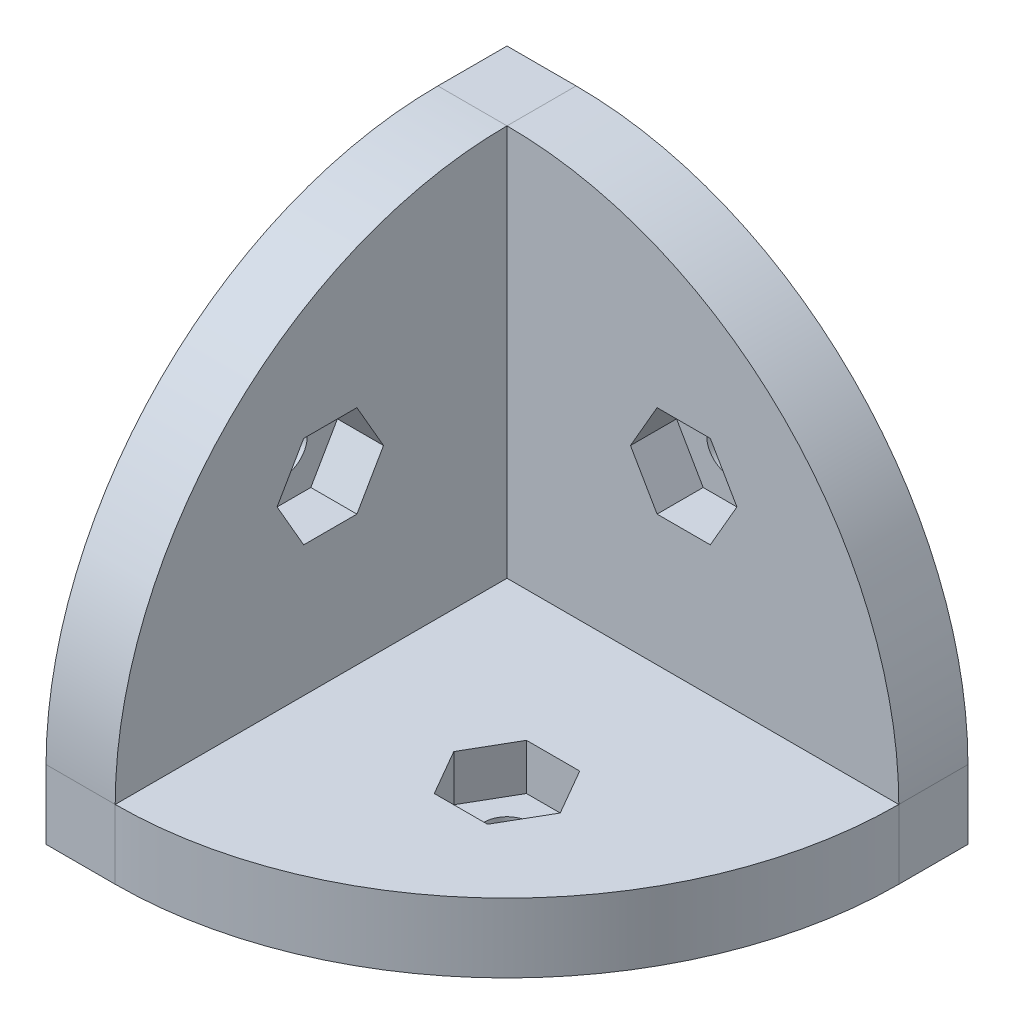
ISO-10303-21;
HEADER;
FILE_DESCRIPTION(('STEP AP214'),'2;1');
FILE_NAME('part.step','',(''),(''),'','','');
FILE_SCHEMA(('AUTOMOTIVE_DESIGN { 1 0 10303 214 1 1 1 1 }'));
ENDSEC;
DATA;
#1=APPLICATION_CONTEXT('core data for automotive mechanical design processes');
#2=APPLICATION_PROTOCOL_DEFINITION('international standard','automotive_design',2000,#1);
#3=PRODUCT_CONTEXT('',#1,'mechanical');
#4=PRODUCT('Part','Part','',(#3));
#5=PRODUCT_RELATED_PRODUCT_CATEGORY('part','',(#4));
#6=PRODUCT_DEFINITION_FORMATION('','',#4);
#7=PRODUCT_DEFINITION_CONTEXT('part definition',#1,'design');
#8=PRODUCT_DEFINITION('design','',#6,#7);
#9=PRODUCT_DEFINITION_SHAPE('','',#8);
#10=(LENGTH_UNIT() NAMED_UNIT(*) SI_UNIT(.MILLI.,.METRE.));
#11=(NAMED_UNIT(*) PLANE_ANGLE_UNIT() SI_UNIT($,.RADIAN.));
#12=(NAMED_UNIT(*) SI_UNIT($,.STERADIAN.) SOLID_ANGLE_UNIT());
#13=UNCERTAINTY_MEASURE_WITH_UNIT(LENGTH_MEASURE(1.E-05),#10,'distance_accuracy_value','');
#14=(GEOMETRIC_REPRESENTATION_CONTEXT(3) GLOBAL_UNCERTAINTY_ASSIGNED_CONTEXT((#13)) GLOBAL_UNIT_ASSIGNED_CONTEXT((#10,
#11,#12)) REPRESENTATION_CONTEXT('',''));
#15=CARTESIAN_POINT('',(0.,0.,0.));
#16=DIRECTION('',(0.,0.,1.));
#17=DIRECTION('',(1.,0.,0.));
#18=AXIS2_PLACEMENT_3D('',#15,#16,#17);
#19=CARTESIAN_POINT('',(0.,16.,16.));
#20=DIRECTION('',(1.,0.,0.));
#21=DIRECTION('',(0.,1.,0.));
#22=AXIS2_PLACEMENT_3D('',#19,#20,#21);
#23=CYLINDRICAL_SURFACE('',#22,1.5);
#24=CARTESIAN_POINT('',(0.,16.,16.));
#25=DIRECTION('',(1.,0.,0.));
#26=DIRECTION('',(0.,1.,0.));
#27=AXIS2_PLACEMENT_3D('',#24,#25,#26);
#28=CIRCLE('',#27,1.5);
#29=CARTESIAN_POINT('',(0.,17.5,16.));
#30=VERTEX_POINT('',#29);
#31=EDGE_CURVE('E259',#30,#30,#28,.T.);
#32=ORIENTED_EDGE('',*,*,#31,.F.);
#33=EDGE_LOOP('',(#32));
#34=FACE_BOUND('',#33,.T.);
#35=CARTESIAN_POINT('',(1.5,16.,16.));
#36=DIRECTION('',(1.,0.,0.));
#37=DIRECTION('',(0.,0.,-1.));
#38=AXIS2_PLACEMENT_3D('',#35,#36,#37);
#39=CIRCLE('',#38,1.5);
#40=CARTESIAN_POINT('',(1.5,16.,14.5));
#41=VERTEX_POINT('',#40);
#42=EDGE_CURVE('E39',#41,#41,#39,.F.);
#43=ORIENTED_EDGE('',*,*,#42,.F.);
#44=EDGE_LOOP('',(#43));
#45=FACE_BOUND('',#44,.T.);
#46=ADVANCED_FACE('F35',(#34,#45),#23,.F.);
#47=CARTESIAN_POINT('',(16.,0.,16.));
#48=DIRECTION('',(0.,1.,0.));
#49=DIRECTION('',(-1.,0.,0.));
#50=AXIS2_PLACEMENT_3D('',#47,#48,#49);
#51=CYLINDRICAL_SURFACE('',#50,1.5);
#52=CARTESIAN_POINT('',(16.,0.,16.));
#53=DIRECTION('',(0.,1.,0.));
#54=DIRECTION('',(-1.,0.,0.));
#55=AXIS2_PLACEMENT_3D('',#52,#53,#54);
#56=CIRCLE('',#55,1.5);
#57=CARTESIAN_POINT('',(14.5,0.,16.));
#58=VERTEX_POINT('',#57);
#59=EDGE_CURVE('E309',#58,#58,#56,.T.);
#60=ORIENTED_EDGE('',*,*,#59,.F.);
#61=EDGE_LOOP('',(#60));
#62=FACE_BOUND('',#61,.T.);
#63=CARTESIAN_POINT('',(16.,1.5,16.));
#64=DIRECTION('',(0.,1.,0.));
#65=DIRECTION('',(0.,0.,1.));
#66=AXIS2_PLACEMENT_3D('',#63,#64,#65);
#67=CIRCLE('',#66,1.5);
#68=CARTESIAN_POINT('',(16.,1.5,17.5));
#69=VERTEX_POINT('',#68);
#70=EDGE_CURVE('E299',#69,#69,#67,.F.);
#71=ORIENTED_EDGE('',*,*,#70,.F.);
#72=EDGE_LOOP('',(#71));
#73=FACE_BOUND('',#72,.T.);
#74=ADVANCED_FACE('F430',(#62,#73),#51,.F.);
#75=CARTESIAN_POINT('',(16.,16.,0.));
#76=DIRECTION('',(0.,0.,1.));
#77=DIRECTION('',(1.,0.,0.));
#78=AXIS2_PLACEMENT_3D('',#75,#76,#77);
#79=CYLINDRICAL_SURFACE('',#78,1.5);
#80=CARTESIAN_POINT('',(16.,16.,0.));
#81=DIRECTION('',(0.,0.,1.));
#82=DIRECTION('',(1.,0.,0.));
#83=AXIS2_PLACEMENT_3D('',#80,#81,#82);
#84=CIRCLE('',#83,1.5);
#85=CARTESIAN_POINT('',(17.5,16.,0.));
#86=VERTEX_POINT('',#85);
#87=EDGE_CURVE('E361',#86,#86,#84,.T.);
#88=ORIENTED_EDGE('',*,*,#87,.F.);
#89=EDGE_LOOP('',(#88));
#90=FACE_BOUND('',#89,.T.);
#91=CARTESIAN_POINT('',(16.,16.,1.5));
#92=DIRECTION('',(0.,0.,1.));
#93=DIRECTION('',(1.,0.,0.));
#94=AXIS2_PLACEMENT_3D('',#91,#92,#93);
#95=CIRCLE('',#94,1.5);
#96=CARTESIAN_POINT('',(17.5,16.,1.5));
#97=VERTEX_POINT('',#96);
#98=EDGE_CURVE('E350',#97,#97,#95,.F.);
#99=ORIENTED_EDGE('',*,*,#98,.F.);
#100=EDGE_LOOP('',(#99));
#101=FACE_BOUND('',#100,.T.);
#102=ADVANCED_FACE('F432',(#90,#101),#79,.F.);
#103=CARTESIAN_POINT('',(4.5,4.5,30.));
#104=DIRECTION('',(0.,1.,0.));
#105=DIRECTION('',(-1.,0.,0.));
#106=AXIS2_PLACEMENT_3D('',#103,#104,#105);
#107=PLANE('',#106);
#108=DIRECTION('',(0.5,0.,-0.866025403784438));
#109=VECTOR('',#108,1.);
#110=CARTESIAN_POINT('',(17.7320508075689,4.5,19.));
#111=LINE('',#110,#109);
#112=CARTESIAN_POINT('',(17.7320508075689,4.5,19.));
#113=VERTEX_POINT('',#112);
#114=CARTESIAN_POINT('',(19.4641016151378,4.5,16.));
#115=VERTEX_POINT('',#114);
#116=EDGE_CURVE('E60',#113,#115,#111,.T.);
#117=ORIENTED_EDGE('',*,*,#116,.F.);
#118=DIRECTION('',(1.,0.,0.));
#119=VECTOR('',#118,1.);
#120=CARTESIAN_POINT('',(14.2679491924311,4.5,19.));
#121=LINE('',#120,#119);
#122=CARTESIAN_POINT('',(14.2679491924311,4.5,19.));
#123=VERTEX_POINT('',#122);
#124=EDGE_CURVE('E266',#123,#113,#121,.T.);
#125=ORIENTED_EDGE('',*,*,#124,.F.);
#126=DIRECTION('',(0.5,0.,0.866025403784439));
#127=VECTOR('',#126,1.);
#128=CARTESIAN_POINT('',(12.5358983848622,4.5,16.));
#129=LINE('',#128,#127);
#130=CARTESIAN_POINT('',(12.5358983848622,4.5,16.));
#131=VERTEX_POINT('',#130);
#132=EDGE_CURVE('E292',#131,#123,#129,.T.);
#133=ORIENTED_EDGE('',*,*,#132,.F.);
#134=DIRECTION('',(-0.5,0.,0.866025403784439));
#135=VECTOR('',#134,1.);
#136=CARTESIAN_POINT('',(14.2679491924311,4.5,13.));
#137=LINE('',#136,#135);
#138=CARTESIAN_POINT('',(14.2679491924311,4.5,13.));
#139=VERTEX_POINT('',#138);
#140=EDGE_CURVE('E289',#139,#131,#137,.T.);
#141=ORIENTED_EDGE('',*,*,#140,.F.);
#142=DIRECTION('',(-1.,0.,0.));
#143=VECTOR('',#142,1.);
#144=CARTESIAN_POINT('',(17.7320508075689,4.5,13.));
#145=LINE('',#144,#143);
#146=CARTESIAN_POINT('',(17.7320508075689,4.5,13.));
#147=VERTEX_POINT('',#146);
#148=EDGE_CURVE('E286',#147,#139,#145,.T.);
#149=ORIENTED_EDGE('',*,*,#148,.F.);
#150=DIRECTION('',(-0.499999999999999,0.,-0.866025403784439));
#151=VECTOR('',#150,1.);
#152=CARTESIAN_POINT('',(19.4641016151378,4.5,16.));
#153=LINE('',#152,#151);
#154=EDGE_CURVE('E283',#115,#147,#153,.T.);
#155=ORIENTED_EDGE('',*,*,#154,.F.);
#156=EDGE_LOOP('',(#117,#125,#133,#141,#149,#155));
#157=FACE_BOUND('',#156,.T.);
#158=CARTESIAN_POINT('',(4.5,4.5,4.5));
#159=DIRECTION('',(0.,-1.,0.));
#160=DIRECTION('',(1.,0.,0.));
#161=AXIS2_PLACEMENT_3D('',#158,#159,#160);
#162=CIRCLE('',#161,25.5);
#163=CARTESIAN_POINT('',(30.,4.5,4.5));
#164=VERTEX_POINT('',#163);
#165=CARTESIAN_POINT('',(4.5,4.5,30.));
#166=VERTEX_POINT('',#165);
#167=EDGE_CURVE('E364',#164,#166,#162,.T.);
#168=ORIENTED_EDGE('',*,*,#167,.F.);
#169=DIRECTION('',(-1.,0.,0.));
#170=VECTOR('',#169,1.);
#171=CARTESIAN_POINT('',(4.5,4.5,4.5));
#172=LINE('',#171,#170);
#173=CARTESIAN_POINT('',(4.5,4.5,4.5));
#174=VERTEX_POINT('',#173);
#175=EDGE_CURVE('E11',#164,#174,#172,.T.);
#176=ORIENTED_EDGE('',*,*,#175,.T.);
#177=DIRECTION('',(0.,0.,-1.));
#178=VECTOR('',#177,1.);
#179=CARTESIAN_POINT('',(4.5,4.5,30.));
#180=LINE('',#179,#178);
#181=EDGE_CURVE('E406',#166,#174,#180,.T.);
#182=ORIENTED_EDGE('',*,*,#181,.F.);
#183=EDGE_LOOP('',(#168,#176,#182));
#184=FACE_BOUND('',#183,.T.);
#185=ADVANCED_FACE('F439',(#157,#184),#107,.T.);
#186=CARTESIAN_POINT('',(30.,0.,30.));
#187=DIRECTION('',(0.,-1.,0.));
#188=DIRECTION('',(1.,0.,0.));
#189=AXIS2_PLACEMENT_3D('',#186,#187,#188);
#190=PLANE('',#189);
#191=ORIENTED_EDGE('',*,*,#59,.T.);
#192=EDGE_LOOP('',(#191));
#193=FACE_BOUND('',#192,.T.);
#194=CARTESIAN_POINT('',(4.5,0.,4.5));
#195=DIRECTION('',(0.,-1.,0.));
#196=DIRECTION('',(1.,0.,0.));
#197=AXIS2_PLACEMENT_3D('',#194,#195,#196);
#198=CIRCLE('',#197,25.5);
#199=CARTESIAN_POINT('',(30.,0.,4.5));
#200=VERTEX_POINT('',#199);
#201=CARTESIAN_POINT('',(4.5,0.,30.));
#202=VERTEX_POINT('',#201);
#203=EDGE_CURVE('E365',#200,#202,#198,.T.);
#204=ORIENTED_EDGE('',*,*,#203,.T.);
#205=DIRECTION('',(-1.,0.,0.));
#206=VECTOR('',#205,1.);
#207=CARTESIAN_POINT('',(30.,0.,30.));
#208=LINE('',#207,#206);
#209=CARTESIAN_POINT('',(0.,0.,30.));
#210=VERTEX_POINT('',#209);
#211=EDGE_CURVE('E400',#202,#210,#208,.T.);
#212=ORIENTED_EDGE('',*,*,#211,.T.);
#213=DIRECTION('',(0.,0.,-1.));
#214=VECTOR('',#213,1.);
#215=CARTESIAN_POINT('',(0.,0.,30.));
#216=LINE('',#215,#214);
#217=CARTESIAN_POINT('',(0.,0.,0.));
#218=VERTEX_POINT('',#217);
#219=EDGE_CURVE('E418',#210,#218,#216,.T.);
#220=ORIENTED_EDGE('',*,*,#219,.T.);
#221=DIRECTION('',(-1.,0.,0.));
#222=VECTOR('',#221,1.);
#223=CARTESIAN_POINT('',(30.,0.,0.));
#224=LINE('',#223,#222);
#225=CARTESIAN_POINT('',(30.,0.,0.));
#226=VERTEX_POINT('',#225);
#227=EDGE_CURVE('E409',#226,#218,#224,.T.);
#228=ORIENTED_EDGE('',*,*,#227,.F.);
#229=DIRECTION('',(0.,0.,-1.));
#230=VECTOR('',#229,1.);
#231=CARTESIAN_POINT('',(30.,0.,30.));
#232=LINE('',#231,#230);
#233=EDGE_CURVE('E420',#200,#226,#232,.T.);
#234=ORIENTED_EDGE('',*,*,#233,.F.);
#235=EDGE_LOOP('',(#204,#212,#220,#228,#234));
#236=FACE_BOUND('',#235,.T.);
#237=ADVANCED_FACE('F510',(#193,#236),#190,.T.);
#238=CARTESIAN_POINT('',(4.5,30.,30.));
#239=DIRECTION('',(1.,0.,0.));
#240=DIRECTION('',(0.,1.,0.));
#241=AXIS2_PLACEMENT_3D('',#238,#239,#240);
#242=PLANE('',#241);
#243=DIRECTION('',(0.,-0.866025403784439,0.5));
#244=VECTOR('',#243,1.);
#245=CARTESIAN_POINT('',(4.5,19.,17.7320508075689));
#246=LINE('',#245,#244);
#247=CARTESIAN_POINT('',(4.5,19.,17.7320508075689));
#248=VERTEX_POINT('',#247);
#249=CARTESIAN_POINT('',(4.5,16.,19.4641016151378));
#250=VERTEX_POINT('',#249);
#251=EDGE_CURVE('E52',#248,#250,#246,.T.);
#252=ORIENTED_EDGE('',*,*,#251,.F.);
#253=DIRECTION('',(0.,0.,1.));
#254=VECTOR('',#253,1.);
#255=CARTESIAN_POINT('',(4.5,19.,14.2679491924311));
#256=LINE('',#255,#254);
#257=CARTESIAN_POINT('',(4.5,19.,14.2679491924311));
#258=VERTEX_POINT('',#257);
#259=EDGE_CURVE('E226',#258,#248,#256,.T.);
#260=ORIENTED_EDGE('',*,*,#259,.F.);
#261=DIRECTION('',(0.,0.866025403784439,0.5));
#262=VECTOR('',#261,1.);
#263=CARTESIAN_POINT('',(4.5,16.,12.5358983848622));
#264=LINE('',#263,#262);
#265=CARTESIAN_POINT('',(4.5,16.,12.5358983848622));
#266=VERTEX_POINT('',#265);
#267=EDGE_CURVE('E229',#266,#258,#264,.T.);
#268=ORIENTED_EDGE('',*,*,#267,.F.);
#269=DIRECTION('',(0.,0.866025403784439,-0.5));
#270=VECTOR('',#269,1.);
#271=CARTESIAN_POINT('',(4.5,13.,14.2679491924311));
#272=LINE('',#271,#270);
#273=CARTESIAN_POINT('',(4.5,13.,14.2679491924311));
#274=VERTEX_POINT('',#273);
#275=EDGE_CURVE('E245',#274,#266,#272,.T.);
#276=ORIENTED_EDGE('',*,*,#275,.F.);
#277=DIRECTION('',(0.,0.,-1.));
#278=VECTOR('',#277,1.);
#279=CARTESIAN_POINT('',(4.5,13.,17.7320508075689));
#280=LINE('',#279,#278);
#281=CARTESIAN_POINT('',(4.5,13.,17.7320508075689));
#282=VERTEX_POINT('',#281);
#283=EDGE_CURVE('E242',#282,#274,#280,.T.);
#284=ORIENTED_EDGE('',*,*,#283,.F.);
#285=DIRECTION('',(0.,-0.866025403784439,-0.5));
#286=VECTOR('',#285,1.);
#287=CARTESIAN_POINT('',(4.5,16.,19.4641016151378));
#288=LINE('',#287,#286);
#289=EDGE_CURVE('E240',#250,#282,#288,.T.);
#290=ORIENTED_EDGE('',*,*,#289,.F.);
#291=EDGE_LOOP('',(#252,#260,#268,#276,#284,#290));
#292=FACE_BOUND('',#291,.T.);
#293=CARTESIAN_POINT('',(4.5,4.5,4.5));
#294=DIRECTION('',(-1.,0.,0.));
#295=DIRECTION('',(0.,1.,0.));
#296=AXIS2_PLACEMENT_3D('',#293,#294,#295);
#297=CIRCLE('',#296,25.5);
#298=CARTESIAN_POINT('',(4.5,30.,4.5));
#299=VERTEX_POINT('',#298);
#300=EDGE_CURVE('E372',#166,#299,#297,.T.);
#301=ORIENTED_EDGE('',*,*,#300,.F.);
#302=ORIENTED_EDGE('',*,*,#181,.T.);
#303=DIRECTION('',(0.,1.,0.));
#304=VECTOR('',#303,1.);
#305=CARTESIAN_POINT('',(4.5,30.,4.5));
#306=LINE('',#305,#304);
#307=EDGE_CURVE('E394',#174,#299,#306,.T.);
#308=ORIENTED_EDGE('',*,*,#307,.T.);
#309=EDGE_LOOP('',(#301,#302,#308));
#310=FACE_BOUND('',#309,.T.);
#311=ADVANCED_FACE('F37',(#292,#310),#242,.T.);
#312=CARTESIAN_POINT('',(0.,0.,30.));
#313=DIRECTION('',(-1.,0.,0.));
#314=DIRECTION('',(0.,0.,1.));
#315=AXIS2_PLACEMENT_3D('',#312,#313,#314);
#316=PLANE('',#315);
#317=ORIENTED_EDGE('',*,*,#31,.T.);
#318=EDGE_LOOP('',(#317));
#319=FACE_BOUND('',#318,.T.);
#320=CARTESIAN_POINT('',(0.,4.5,4.5));
#321=DIRECTION('',(-1.,0.,0.));
#322=DIRECTION('',(0.,1.,0.));
#323=AXIS2_PLACEMENT_3D('',#320,#321,#322);
#324=CIRCLE('',#323,25.5);
#325=CARTESIAN_POINT('',(0.,4.5,30.));
#326=VERTEX_POINT('',#325);
#327=CARTESIAN_POINT('',(0.,30.,4.5));
#328=VERTEX_POINT('',#327);
#329=EDGE_CURVE('E375',#326,#328,#324,.T.);
#330=ORIENTED_EDGE('',*,*,#329,.T.);
#331=DIRECTION('',(0.,0.,-1.));
#332=VECTOR('',#331,1.);
#333=CARTESIAN_POINT('',(0.,30.,30.));
#334=LINE('',#333,#332);
#335=CARTESIAN_POINT('',(0.,30.,0.));
#336=VERTEX_POINT('',#335);
#337=EDGE_CURVE('E44',#328,#336,#334,.T.);
#338=ORIENTED_EDGE('',*,*,#337,.T.);
#339=DIRECTION('',(0.,1.,0.));
#340=VECTOR('',#339,1.);
#341=CARTESIAN_POINT('',(0.,0.,0.));
#342=LINE('',#341,#340);
#343=EDGE_CURVE('E412',#218,#336,#342,.T.);
#344=ORIENTED_EDGE('',*,*,#343,.F.);
#345=ORIENTED_EDGE('',*,*,#219,.F.);
#346=DIRECTION('',(0.,1.,0.));
#347=VECTOR('',#346,1.);
#348=CARTESIAN_POINT('',(0.,0.,30.));
#349=LINE('',#348,#347);
#350=EDGE_CURVE('E402',#210,#326,#349,.T.);
#351=ORIENTED_EDGE('',*,*,#350,.T.);
#352=EDGE_LOOP('',(#330,#338,#344,#345,#351));
#353=FACE_BOUND('',#352,.T.);
#354=ADVANCED_FACE('F505',(#319,#353),#316,.T.);
#355=CARTESIAN_POINT('',(0.,30.,30.));
#356=DIRECTION('',(0.,1.,0.));
#357=DIRECTION('',(0.,0.,1.));
#358=AXIS2_PLACEMENT_3D('',#355,#356,#357);
#359=PLANE('',#358);
#360=DIRECTION('',(1.,0.,0.));
#361=VECTOR('',#360,1.);
#362=CARTESIAN_POINT('',(0.,30.,4.5));
#363=LINE('',#362,#361);
#364=EDGE_CURVE('E380',#328,#299,#363,.T.);
#365=ORIENTED_EDGE('',*,*,#364,.T.);
#366=DIRECTION('',(0.,0.,-1.));
#367=VECTOR('',#366,1.);
#368=CARTESIAN_POINT('',(4.5,30.,4.5));
#369=LINE('',#368,#367);
#370=CARTESIAN_POINT('',(4.5,30.,0.));
#371=VERTEX_POINT('',#370);
#372=EDGE_CURVE('E389',#299,#371,#369,.T.);
#373=ORIENTED_EDGE('',*,*,#372,.T.);
#374=DIRECTION('',(1.,0.,0.));
#375=VECTOR('',#374,1.);
#376=CARTESIAN_POINT('',(0.,30.,0.));
#377=LINE('',#376,#375);
#378=EDGE_CURVE('E403',#336,#371,#377,.T.);
#379=ORIENTED_EDGE('',*,*,#378,.F.);
#380=ORIENTED_EDGE('',*,*,#337,.F.);
#381=EDGE_LOOP('',(#365,#373,#379,#380));
#382=FACE_BOUND('',#381,.T.);
#383=ADVANCED_FACE('F502',(#382),#359,.T.);
#384=CARTESIAN_POINT('',(30.,4.5,30.));
#385=DIRECTION('',(1.,0.,0.));
#386=DIRECTION('',(0.,0.,-1.));
#387=AXIS2_PLACEMENT_3D('',#384,#385,#386);
#388=PLANE('',#387);
#389=DIRECTION('',(0.,1.,0.));
#390=VECTOR('',#389,1.);
#391=CARTESIAN_POINT('',(30.,0.,4.5));
#392=LINE('',#391,#390);
#393=EDGE_CURVE('E370',#200,#164,#392,.T.);
#394=ORIENTED_EDGE('',*,*,#393,.F.);
#395=ORIENTED_EDGE('',*,*,#233,.T.);
#396=DIRECTION('',(0.,-1.,0.));
#397=VECTOR('',#396,1.);
#398=CARTESIAN_POINT('',(30.,4.5,0.));
#399=LINE('',#398,#397);
#400=CARTESIAN_POINT('',(30.,4.5,0.));
#401=VERTEX_POINT('',#400);
#402=EDGE_CURVE('E399',#401,#226,#399,.T.);
#403=ORIENTED_EDGE('',*,*,#402,.F.);
#404=DIRECTION('',(0.,0.,-1.));
#405=VECTOR('',#404,1.);
#406=CARTESIAN_POINT('',(30.,4.5,4.5));
#407=LINE('',#406,#405);
#408=EDGE_CURVE('E391',#164,#401,#407,.T.);
#409=ORIENTED_EDGE('',*,*,#408,.F.);
#410=EDGE_LOOP('',(#394,#395,#403,#409));
#411=FACE_BOUND('',#410,.T.);
#412=ADVANCED_FACE('F497',(#411),#388,.T.);
#413=CARTESIAN_POINT('',(0.,0.,30.));
#414=DIRECTION('',(0.,0.,1.));
#415=DIRECTION('',(1.,0.,0.));
#416=AXIS2_PLACEMENT_3D('',#413,#414,#415);
#417=PLANE('',#416);
#418=DIRECTION('',(0.,1.,0.));
#419=VECTOR('',#418,1.);
#420=CARTESIAN_POINT('',(4.5,0.,30.));
#421=LINE('',#420,#419);
#422=EDGE_CURVE('E368',#202,#166,#421,.T.);
#423=ORIENTED_EDGE('',*,*,#422,.T.);
#424=DIRECTION('',(1.,0.,0.));
#425=VECTOR('',#424,1.);
#426=CARTESIAN_POINT('',(0.,4.5,30.));
#427=LINE('',#426,#425);
#428=EDGE_CURVE('E378',#326,#166,#427,.T.);
#429=ORIENTED_EDGE('',*,*,#428,.F.);
#430=ORIENTED_EDGE('',*,*,#350,.F.);
#431=ORIENTED_EDGE('',*,*,#211,.F.);
#432=EDGE_LOOP('',(#423,#429,#430,#431));
#433=FACE_BOUND('',#432,.T.);
#434=ADVANCED_FACE('F494',(#433),#417,.T.);
#435=CARTESIAN_POINT('',(0.,0.,0.));
#436=DIRECTION('',(0.,0.,1.));
#437=DIRECTION('',(1.,0.,0.));
#438=AXIS2_PLACEMENT_3D('',#435,#436,#437);
#439=PLANE('',#438);
#440=ORIENTED_EDGE('',*,*,#87,.T.);
#441=EDGE_LOOP('',(#440));
#442=FACE_BOUND('',#441,.T.);
#443=ORIENTED_EDGE('',*,*,#378,.T.);
#444=CARTESIAN_POINT('',(4.5,4.5,0.));
#445=DIRECTION('',(0.,0.,-1.));
#446=DIRECTION('',(-1.,0.,0.));
#447=AXIS2_PLACEMENT_3D('',#444,#445,#446);
#448=CIRCLE('',#447,25.5);
#449=EDGE_CURVE('E383',#371,#401,#448,.T.);
#450=ORIENTED_EDGE('',*,*,#449,.T.);
#451=ORIENTED_EDGE('',*,*,#402,.T.);
#452=ORIENTED_EDGE('',*,*,#227,.T.);
#453=ORIENTED_EDGE('',*,*,#343,.T.);
#454=EDGE_LOOP('',(#443,#450,#451,#452,#453));
#455=FACE_BOUND('',#454,.T.);
#456=ADVANCED_FACE('F492',(#442,#455),#439,.F.);
#457=CARTESIAN_POINT('',(4.5,4.5,4.5));
#458=DIRECTION('',(0.,0.,-1.));
#459=DIRECTION('',(-1.,0.,0.));
#460=AXIS2_PLACEMENT_3D('',#457,#458,#459);
#461=CYLINDRICAL_SURFACE('',#460,25.5);
#462=ORIENTED_EDGE('',*,*,#449,.F.);
#463=ORIENTED_EDGE('',*,*,#372,.F.);
#464=CARTESIAN_POINT('',(4.5,4.5,4.5));
#465=DIRECTION('',(0.,0.,-1.));
#466=DIRECTION('',(-1.,0.,0.));
#467=AXIS2_PLACEMENT_3D('',#464,#465,#466);
#468=CIRCLE('',#467,25.5);
#469=EDGE_CURVE('E386',#299,#164,#468,.T.);
#470=ORIENTED_EDGE('',*,*,#469,.T.);
#471=ORIENTED_EDGE('',*,*,#408,.T.);
#472=EDGE_LOOP('',(#462,#463,#470,#471));
#473=FACE_BOUND('',#472,.T.);
#474=ADVANCED_FACE('F488',(#473),#461,.T.);
#475=CARTESIAN_POINT('',(4.5,4.5,4.5));
#476=DIRECTION('',(0.,0.,-1.));
#477=DIRECTION('',(-1.,0.,0.));
#478=AXIS2_PLACEMENT_3D('',#475,#476,#477);
#479=PLANE('',#478);
#480=DIRECTION('',(-0.5,0.866025403784439,0.));
#481=VECTOR('',#480,1.);
#482=CARTESIAN_POINT('',(19.4641016151378,16.,4.5));
#483=LINE('',#482,#481);
#484=CARTESIAN_POINT('',(19.4641016151378,16.,4.5));
#485=VERTEX_POINT('',#484);
#486=CARTESIAN_POINT('',(17.7320508075689,19.,4.5));
#487=VERTEX_POINT('',#486);
#488=EDGE_CURVE('E334',#485,#487,#483,.T.);
#489=ORIENTED_EDGE('',*,*,#488,.F.);
#490=DIRECTION('',(0.5,0.866025403784438,0.));
#491=VECTOR('',#490,1.);
#492=CARTESIAN_POINT('',(17.7320508075689,13.,4.5));
#493=LINE('',#492,#491);
#494=CARTESIAN_POINT('',(17.7320508075689,13.,4.5));
#495=VERTEX_POINT('',#494);
#496=EDGE_CURVE('E312',#495,#485,#493,.T.);
#497=ORIENTED_EDGE('',*,*,#496,.F.);
#498=DIRECTION('',(1.,0.,0.));
#499=VECTOR('',#498,1.);
#500=CARTESIAN_POINT('',(14.2679491924311,13.,4.5));
#501=LINE('',#500,#499);
#502=CARTESIAN_POINT('',(14.2679491924311,13.,4.5));
#503=VERTEX_POINT('',#502);
#504=EDGE_CURVE('E317',#503,#495,#501,.T.);
#505=ORIENTED_EDGE('',*,*,#504,.F.);
#506=DIRECTION('',(0.5,-0.866025403784438,0.));
#507=VECTOR('',#506,1.);
#508=CARTESIAN_POINT('',(12.5358983848622,16.,4.5));
#509=LINE('',#508,#507);
#510=CARTESIAN_POINT('',(12.5358983848622,16.,4.5));
#511=VERTEX_POINT('',#510);
#512=EDGE_CURVE('E343',#511,#503,#509,.T.);
#513=ORIENTED_EDGE('',*,*,#512,.F.);
#514=DIRECTION('',(-0.5,-0.866025403784439,0.));
#515=VECTOR('',#514,1.);
#516=CARTESIAN_POINT('',(14.2679491924311,19.,4.5));
#517=LINE('',#516,#515);
#518=CARTESIAN_POINT('',(14.2679491924311,19.,4.5));
#519=VERTEX_POINT('',#518);
#520=EDGE_CURVE('E340',#519,#511,#517,.T.);
#521=ORIENTED_EDGE('',*,*,#520,.F.);
#522=DIRECTION('',(-1.,0.,0.));
#523=VECTOR('',#522,1.);
#524=CARTESIAN_POINT('',(17.7320508075689,19.,4.5));
#525=LINE('',#524,#523);
#526=EDGE_CURVE('E337',#487,#519,#525,.T.);
#527=ORIENTED_EDGE('',*,*,#526,.F.);
#528=EDGE_LOOP('',(#489,#497,#505,#513,#521,#527));
#529=FACE_BOUND('',#528,.T.);
#530=ORIENTED_EDGE('',*,*,#307,.F.);
#531=ORIENTED_EDGE('',*,*,#175,.F.);
#532=ORIENTED_EDGE('',*,*,#469,.F.);
#533=EDGE_LOOP('',(#530,#531,#532));
#534=FACE_BOUND('',#533,.T.);
#535=ADVANCED_FACE('F484',(#529,#534),#479,.F.);
#536=CARTESIAN_POINT('',(0.,4.5,4.5));
#537=DIRECTION('',(1.,0.,0.));
#538=DIRECTION('',(0.,1.,0.));
#539=AXIS2_PLACEMENT_3D('',#536,#537,#538);
#540=CYLINDRICAL_SURFACE('',#539,25.5);
#541=ORIENTED_EDGE('',*,*,#300,.T.);
#542=ORIENTED_EDGE('',*,*,#364,.F.);
#543=ORIENTED_EDGE('',*,*,#329,.F.);
#544=ORIENTED_EDGE('',*,*,#428,.T.);
#545=EDGE_LOOP('',(#541,#542,#543,#544));
#546=FACE_BOUND('',#545,.T.);
#547=ADVANCED_FACE('F480',(#546),#540,.T.);
#548=CARTESIAN_POINT('',(4.5,0.,4.5));
#549=DIRECTION('',(0.,1.,0.));
#550=DIRECTION('',(-1.,0.,0.));
#551=AXIS2_PLACEMENT_3D('',#548,#549,#550);
#552=CYLINDRICAL_SURFACE('',#551,25.5);
#553=ORIENTED_EDGE('',*,*,#167,.T.);
#554=ORIENTED_EDGE('',*,*,#422,.F.);
#555=ORIENTED_EDGE('',*,*,#203,.F.);
#556=ORIENTED_EDGE('',*,*,#393,.T.);
#557=EDGE_LOOP('',(#553,#554,#555,#556));
#558=FACE_BOUND('',#557,.T.);
#559=ADVANCED_FACE('F453',(#558),#552,.T.);
#560=CARTESIAN_POINT('',(0.,0.,1.5));
#561=DIRECTION('',(0.,0.,1.));
#562=DIRECTION('',(1.,0.,0.));
#563=AXIS2_PLACEMENT_3D('',#560,#561,#562);
#564=PLANE('',#563);
#565=DIRECTION('',(0.5,0.866025403784438,0.));
#566=VECTOR('',#565,1.);
#567=CARTESIAN_POINT('',(17.7320508075689,13.,1.5));
#568=LINE('',#567,#566);
#569=CARTESIAN_POINT('',(17.7320508075689,13.,1.5));
#570=VERTEX_POINT('',#569);
#571=CARTESIAN_POINT('',(19.4641016151378,16.,1.5));
#572=VERTEX_POINT('',#571);
#573=EDGE_CURVE('E313',#570,#572,#568,.T.);
#574=ORIENTED_EDGE('',*,*,#573,.T.);
#575=DIRECTION('',(-0.5,0.866025403784439,0.));
#576=VECTOR('',#575,1.);
#577=CARTESIAN_POINT('',(19.4641016151378,16.,1.5));
#578=LINE('',#577,#576);
#579=CARTESIAN_POINT('',(17.7320508075689,19.,1.5));
#580=VERTEX_POINT('',#579);
#581=EDGE_CURVE('E316',#572,#580,#578,.T.);
#582=ORIENTED_EDGE('',*,*,#581,.T.);
#583=DIRECTION('',(-1.,0.,0.));
#584=VECTOR('',#583,1.);
#585=CARTESIAN_POINT('',(17.7320508075689,19.,1.5));
#586=LINE('',#585,#584);
#587=CARTESIAN_POINT('',(14.2679491924311,19.,1.5));
#588=VERTEX_POINT('',#587);
#589=EDGE_CURVE('E320',#580,#588,#586,.T.);
#590=ORIENTED_EDGE('',*,*,#589,.T.);
#591=DIRECTION('',(-0.5,-0.866025403784439,0.));
#592=VECTOR('',#591,1.);
#593=CARTESIAN_POINT('',(14.2679491924311,19.,1.5));
#594=LINE('',#593,#592);
#595=CARTESIAN_POINT('',(12.5358983848622,16.,1.5));
#596=VERTEX_POINT('',#595);
#597=EDGE_CURVE('E323',#588,#596,#594,.T.);
#598=ORIENTED_EDGE('',*,*,#597,.T.);
#599=DIRECTION('',(0.5,-0.866025403784438,0.));
#600=VECTOR('',#599,1.);
#601=CARTESIAN_POINT('',(12.5358983848622,16.,1.5));
#602=LINE('',#601,#600);
#603=CARTESIAN_POINT('',(14.2679491924311,13.,1.5));
#604=VERTEX_POINT('',#603);
#605=EDGE_CURVE('E326',#596,#604,#602,.T.);
#606=ORIENTED_EDGE('',*,*,#605,.T.);
#607=DIRECTION('',(1.,0.,0.));
#608=VECTOR('',#607,1.);
#609=CARTESIAN_POINT('',(14.2679491924311,13.,1.5));
#610=LINE('',#609,#608);
#611=EDGE_CURVE('E329',#604,#570,#610,.T.);
#612=ORIENTED_EDGE('',*,*,#611,.T.);
#613=EDGE_LOOP('',(#574,#582,#590,#598,#606,#612));
#614=FACE_BOUND('',#613,.T.);
#615=ORIENTED_EDGE('',*,*,#98,.T.);
#616=EDGE_LOOP('',(#615));
#617=FACE_BOUND('',#616,.T.);
#618=ADVANCED_FACE('F449',(#614,#617),#564,.T.);
#619=CARTESIAN_POINT('',(17.7320508075689,13.,1.5));
#620=DIRECTION('',(0.866025403784439,-0.5,0.));
#621=DIRECTION('',(0.5,0.866025403784439,0.));
#622=AXIS2_PLACEMENT_3D('',#619,#620,#621);
#623=PLANE('',#622);
#624=ORIENTED_EDGE('',*,*,#496,.T.);
#625=DIRECTION('',(0.,0.,1.));
#626=VECTOR('',#625,1.);
#627=CARTESIAN_POINT('',(19.4641016151378,16.,1.5));
#628=LINE('',#627,#626);
#629=EDGE_CURVE('E332',#572,#485,#628,.T.);
#630=ORIENTED_EDGE('',*,*,#629,.F.);
#631=ORIENTED_EDGE('',*,*,#573,.F.);
#632=DIRECTION('',(0.,0.,1.));
#633=VECTOR('',#632,1.);
#634=CARTESIAN_POINT('',(17.7320508075689,13.,1.5));
#635=LINE('',#634,#633);
#636=EDGE_CURVE('E348',#570,#495,#635,.T.);
#637=ORIENTED_EDGE('',*,*,#636,.T.);
#638=EDGE_LOOP('',(#624,#630,#631,#637));
#639=FACE_BOUND('',#638,.T.);
#640=ADVANCED_FACE('F452',(#639),#623,.F.);
#641=CARTESIAN_POINT('',(14.2679491924311,13.,1.5));
#642=DIRECTION('',(0.,-1.,0.));
#643=DIRECTION('',(0.,0.,-1.));
#644=AXIS2_PLACEMENT_3D('',#641,#642,#643);
#645=PLANE('',#644);
#646=ORIENTED_EDGE('',*,*,#504,.T.);
#647=ORIENTED_EDGE('',*,*,#636,.F.);
#648=ORIENTED_EDGE('',*,*,#611,.F.);
#649=DIRECTION('',(0.,0.,1.));
#650=VECTOR('',#649,1.);
#651=CARTESIAN_POINT('',(14.2679491924311,13.,1.5));
#652=LINE('',#651,#650);
#653=EDGE_CURVE('E351',#604,#503,#652,.T.);
#654=ORIENTED_EDGE('',*,*,#653,.T.);
#655=EDGE_LOOP('',(#646,#647,#648,#654));
#656=FACE_BOUND('',#655,.T.);
#657=ADVANCED_FACE('F455',(#656),#645,.F.);
#658=CARTESIAN_POINT('',(12.5358983848622,16.,1.5));
#659=DIRECTION('',(-0.866025403784439,-0.5,0.));
#660=DIRECTION('',(0.5,-0.866025403784439,0.));
#661=AXIS2_PLACEMENT_3D('',#658,#659,#660);
#662=PLANE('',#661);
#663=ORIENTED_EDGE('',*,*,#512,.T.);
#664=ORIENTED_EDGE('',*,*,#653,.F.);
#665=ORIENTED_EDGE('',*,*,#605,.F.);
#666=DIRECTION('',(0.,0.,1.));
#667=VECTOR('',#666,1.);
#668=CARTESIAN_POINT('',(12.5358983848622,16.,1.5));
#669=LINE('',#668,#667);
#670=EDGE_CURVE('E353',#596,#511,#669,.T.);
#671=ORIENTED_EDGE('',*,*,#670,.T.);
#672=EDGE_LOOP('',(#663,#664,#665,#671));
#673=FACE_BOUND('',#672,.T.);
#674=ADVANCED_FACE('F458',(#673),#662,.F.);
#675=CARTESIAN_POINT('',(14.2679491924311,19.,1.5));
#676=DIRECTION('',(-0.866025403784439,0.5,0.));
#677=DIRECTION('',(-0.5,-0.866025403784439,0.));
#678=AXIS2_PLACEMENT_3D('',#675,#676,#677);
#679=PLANE('',#678);
#680=ORIENTED_EDGE('',*,*,#520,.T.);
#681=ORIENTED_EDGE('',*,*,#670,.F.);
#682=ORIENTED_EDGE('',*,*,#597,.F.);
#683=DIRECTION('',(0.,0.,1.));
#684=VECTOR('',#683,1.);
#685=CARTESIAN_POINT('',(14.2679491924311,19.,1.5));
#686=LINE('',#685,#684);
#687=EDGE_CURVE('E355',#588,#519,#686,.T.);
#688=ORIENTED_EDGE('',*,*,#687,.T.);
#689=EDGE_LOOP('',(#680,#681,#682,#688));
#690=FACE_BOUND('',#689,.T.);
#691=ADVANCED_FACE('F462',(#690),#679,.F.);
#692=CARTESIAN_POINT('',(17.7320508075689,19.,1.5));
#693=DIRECTION('',(0.,1.,0.));
#694=DIRECTION('',(0.,0.,1.));
#695=AXIS2_PLACEMENT_3D('',#692,#693,#694);
#696=PLANE('',#695);
#697=ORIENTED_EDGE('',*,*,#526,.T.);
#698=ORIENTED_EDGE('',*,*,#687,.F.);
#699=ORIENTED_EDGE('',*,*,#589,.F.);
#700=DIRECTION('',(0.,0.,1.));
#701=VECTOR('',#700,1.);
#702=CARTESIAN_POINT('',(17.7320508075689,19.,1.5));
#703=LINE('',#702,#701);
#704=EDGE_CURVE('E357',#580,#487,#703,.T.);
#705=ORIENTED_EDGE('',*,*,#704,.T.);
#706=EDGE_LOOP('',(#697,#698,#699,#705));
#707=FACE_BOUND('',#706,.T.);
#708=ADVANCED_FACE('F466',(#707),#696,.F.);
#709=CARTESIAN_POINT('',(19.4641016151378,16.,1.5));
#710=DIRECTION('',(0.866025403784439,0.5,0.));
#711=DIRECTION('',(-0.5,0.866025403784439,0.));
#712=AXIS2_PLACEMENT_3D('',#709,#710,#711);
#713=PLANE('',#712);
#714=ORIENTED_EDGE('',*,*,#488,.T.);
#715=ORIENTED_EDGE('',*,*,#704,.F.);
#716=ORIENTED_EDGE('',*,*,#581,.F.);
#717=ORIENTED_EDGE('',*,*,#629,.T.);
#718=EDGE_LOOP('',(#714,#715,#716,#717));
#719=FACE_BOUND('',#718,.T.);
#720=ADVANCED_FACE('F470',(#719),#713,.F.);
#721=CARTESIAN_POINT('',(0.,1.5,0.));
#722=DIRECTION('',(0.,1.,0.));
#723=DIRECTION('',(0.,0.,1.));
#724=AXIS2_PLACEMENT_3D('',#721,#722,#723);
#725=PLANE('',#724);
#726=DIRECTION('',(0.5,0.,-0.866025403784438));
#727=VECTOR('',#726,1.);
#728=CARTESIAN_POINT('',(17.7320508075689,1.5,19.));
#729=LINE('',#728,#727);
#730=CARTESIAN_POINT('',(17.7320508075689,1.5,19.));
#731=VERTEX_POINT('',#730);
#732=CARTESIAN_POINT('',(19.4641016151378,1.5,16.));
#733=VERTEX_POINT('',#732);
#734=EDGE_CURVE('E262',#731,#733,#729,.T.);
#735=ORIENTED_EDGE('',*,*,#734,.T.);
#736=DIRECTION('',(-0.499999999999999,0.,-0.866025403784439));
#737=VECTOR('',#736,1.);
#738=CARTESIAN_POINT('',(19.4641016151378,1.5,16.));
#739=LINE('',#738,#737);
#740=CARTESIAN_POINT('',(17.7320508075689,1.5,13.));
#741=VERTEX_POINT('',#740);
#742=EDGE_CURVE('E265',#733,#741,#739,.T.);
#743=ORIENTED_EDGE('',*,*,#742,.T.);
#744=DIRECTION('',(-1.,0.,0.));
#745=VECTOR('',#744,1.);
#746=CARTESIAN_POINT('',(17.7320508075689,1.5,13.));
#747=LINE('',#746,#745);
#748=CARTESIAN_POINT('',(14.2679491924311,1.5,13.));
#749=VERTEX_POINT('',#748);
#750=EDGE_CURVE('E269',#741,#749,#747,.T.);
#751=ORIENTED_EDGE('',*,*,#750,.T.);
#752=DIRECTION('',(-0.5,0.,0.866025403784439));
#753=VECTOR('',#752,1.);
#754=CARTESIAN_POINT('',(14.2679491924311,1.5,13.));
#755=LINE('',#754,#753);
#756=CARTESIAN_POINT('',(12.5358983848622,1.5,16.));
#757=VERTEX_POINT('',#756);
#758=EDGE_CURVE('E272',#749,#757,#755,.T.);
#759=ORIENTED_EDGE('',*,*,#758,.T.);
#760=DIRECTION('',(0.5,0.,0.866025403784439));
#761=VECTOR('',#760,1.);
#762=CARTESIAN_POINT('',(12.5358983848622,1.5,16.));
#763=LINE('',#762,#761);
#764=CARTESIAN_POINT('',(14.2679491924311,1.5,19.));
#765=VERTEX_POINT('',#764);
#766=EDGE_CURVE('E275',#757,#765,#763,.T.);
#767=ORIENTED_EDGE('',*,*,#766,.T.);
#768=DIRECTION('',(1.,0.,0.));
#769=VECTOR('',#768,1.);
#770=CARTESIAN_POINT('',(14.2679491924311,1.5,19.));
#771=LINE('',#770,#769);
#772=EDGE_CURVE('E278',#765,#731,#771,.T.);
#773=ORIENTED_EDGE('',*,*,#772,.T.);
#774=EDGE_LOOP('',(#735,#743,#751,#759,#767,#773));
#775=FACE_BOUND('',#774,.T.);
#776=ORIENTED_EDGE('',*,*,#70,.T.);
#777=EDGE_LOOP('',(#776));
#778=FACE_BOUND('',#777,.T.);
#779=ADVANCED_FACE('F428',(#775,#778),#725,.T.);
#780=CARTESIAN_POINT('',(17.7320508075689,1.5,19.));
#781=DIRECTION('',(0.866025403784438,0.,0.5));
#782=DIRECTION('',(0.5,0.,-0.866025403784438));
#783=AXIS2_PLACEMENT_3D('',#780,#781,#782);
#784=PLANE('',#783);
#785=ORIENTED_EDGE('',*,*,#116,.T.);
#786=DIRECTION('',(0.,1.,0.));
#787=VECTOR('',#786,1.);
#788=CARTESIAN_POINT('',(19.4641016151378,1.5,16.));
#789=LINE('',#788,#787);
#790=EDGE_CURVE('E281',#733,#115,#789,.T.);
#791=ORIENTED_EDGE('',*,*,#790,.F.);
#792=ORIENTED_EDGE('',*,*,#734,.F.);
#793=DIRECTION('',(0.,1.,0.));
#794=VECTOR('',#793,1.);
#795=CARTESIAN_POINT('',(17.7320508075689,1.5,19.));
#796=LINE('',#795,#794);
#797=EDGE_CURVE('E297',#731,#113,#796,.T.);
#798=ORIENTED_EDGE('',*,*,#797,.T.);
#799=EDGE_LOOP('',(#785,#791,#792,#798));
#800=FACE_BOUND('',#799,.T.);
#801=ADVANCED_FACE('F447',(#800),#784,.F.);
#802=CARTESIAN_POINT('',(14.2679491924311,1.5,19.));
#803=DIRECTION('',(0.,0.,1.));
#804=DIRECTION('',(1.,0.,0.));
#805=AXIS2_PLACEMENT_3D('',#802,#803,#804);
#806=PLANE('',#805);
#807=ORIENTED_EDGE('',*,*,#124,.T.);
#808=ORIENTED_EDGE('',*,*,#797,.F.);
#809=ORIENTED_EDGE('',*,*,#772,.F.);
#810=DIRECTION('',(0.,1.,0.));
#811=VECTOR('',#810,1.);
#812=CARTESIAN_POINT('',(14.2679491924311,1.5,19.));
#813=LINE('',#812,#811);
#814=EDGE_CURVE('E300',#765,#123,#813,.T.);
#815=ORIENTED_EDGE('',*,*,#814,.T.);
#816=EDGE_LOOP('',(#807,#808,#809,#815));
#817=FACE_BOUND('',#816,.T.);
#818=ADVANCED_FACE('F582',(#817),#806,.F.);
#819=CARTESIAN_POINT('',(12.5358983848622,1.5,16.));
#820=DIRECTION('',(-0.866025403784439,0.,0.5));
#821=DIRECTION('',(0.5,0.,0.866025403784439));
#822=AXIS2_PLACEMENT_3D('',#819,#820,#821);
#823=PLANE('',#822);
#824=ORIENTED_EDGE('',*,*,#132,.T.);
#825=ORIENTED_EDGE('',*,*,#814,.F.);
#826=ORIENTED_EDGE('',*,*,#766,.F.);
#827=DIRECTION('',(0.,1.,0.));
#828=VECTOR('',#827,1.);
#829=CARTESIAN_POINT('',(12.5358983848622,1.5,16.));
#830=LINE('',#829,#828);
#831=EDGE_CURVE('E302',#757,#131,#830,.T.);
#832=ORIENTED_EDGE('',*,*,#831,.T.);
#833=EDGE_LOOP('',(#824,#825,#826,#832));
#834=FACE_BOUND('',#833,.T.);
#835=ADVANCED_FACE('F585',(#834),#823,.F.);
#836=CARTESIAN_POINT('',(14.2679491924311,1.5,13.));
#837=DIRECTION('',(-0.866025403784439,0.,-0.5));
#838=DIRECTION('',(-0.5,0.,0.866025403784439));
#839=AXIS2_PLACEMENT_3D('',#836,#837,#838);
#840=PLANE('',#839);
#841=ORIENTED_EDGE('',*,*,#140,.T.);
#842=ORIENTED_EDGE('',*,*,#831,.F.);
#843=ORIENTED_EDGE('',*,*,#758,.F.);
#844=DIRECTION('',(0.,1.,0.));
#845=VECTOR('',#844,1.);
#846=CARTESIAN_POINT('',(14.2679491924311,1.5,13.));
#847=LINE('',#846,#845);
#848=EDGE_CURVE('E304',#749,#139,#847,.T.);
#849=ORIENTED_EDGE('',*,*,#848,.T.);
#850=EDGE_LOOP('',(#841,#842,#843,#849));
#851=FACE_BOUND('',#850,.T.);
#852=ADVANCED_FACE('F589',(#851),#840,.F.);
#853=CARTESIAN_POINT('',(17.7320508075689,1.5,13.));
#854=DIRECTION('',(0.,0.,-1.));
#855=DIRECTION('',(-1.,0.,0.));
#856=AXIS2_PLACEMENT_3D('',#853,#854,#855);
#857=PLANE('',#856);
#858=ORIENTED_EDGE('',*,*,#148,.T.);
#859=ORIENTED_EDGE('',*,*,#848,.F.);
#860=ORIENTED_EDGE('',*,*,#750,.F.);
#861=DIRECTION('',(0.,1.,0.));
#862=VECTOR('',#861,1.);
#863=CARTESIAN_POINT('',(17.7320508075689,1.5,13.));
#864=LINE('',#863,#862);
#865=EDGE_CURVE('E306',#741,#147,#864,.T.);
#866=ORIENTED_EDGE('',*,*,#865,.T.);
#867=EDGE_LOOP('',(#858,#859,#860,#866));
#868=FACE_BOUND('',#867,.T.);
#869=ADVANCED_FACE('F593',(#868),#857,.F.);
#870=CARTESIAN_POINT('',(19.4641016151378,1.5,16.));
#871=DIRECTION('',(0.866025403784439,0.,-0.5));
#872=DIRECTION('',(-0.5,0.,-0.866025403784439));
#873=AXIS2_PLACEMENT_3D('',#870,#871,#872);
#874=PLANE('',#873);
#875=ORIENTED_EDGE('',*,*,#154,.T.);
#876=ORIENTED_EDGE('',*,*,#865,.F.);
#877=ORIENTED_EDGE('',*,*,#742,.F.);
#878=ORIENTED_EDGE('',*,*,#790,.T.);
#879=EDGE_LOOP('',(#875,#876,#877,#878));
#880=FACE_BOUND('',#879,.T.);
#881=ADVANCED_FACE('F596',(#880),#874,.F.);
#882=CARTESIAN_POINT('',(1.50000000000001,0.,0.));
#883=DIRECTION('',(1.,0.,0.));
#884=DIRECTION('',(0.,0.,-1.));
#885=AXIS2_PLACEMENT_3D('',#882,#883,#884);
#886=PLANE('',#885);
#887=DIRECTION('',(0.,-0.866025403784439,0.5));
#888=VECTOR('',#887,1.);
#889=CARTESIAN_POINT('',(1.5,19.,17.7320508075689));
#890=LINE('',#889,#888);
#891=CARTESIAN_POINT('',(1.5,19.,17.7320508075689));
#892=VERTEX_POINT('',#891);
#893=CARTESIAN_POINT('',(1.5,16.,19.4641016151378));
#894=VERTEX_POINT('',#893);
#895=EDGE_CURVE('E206',#892,#894,#890,.T.);
#896=ORIENTED_EDGE('',*,*,#895,.T.);
#897=DIRECTION('',(0.,-0.866025403784439,-0.5));
#898=VECTOR('',#897,1.);
#899=CARTESIAN_POINT('',(1.5,16.,19.4641016151378));
#900=LINE('',#899,#898);
#901=CARTESIAN_POINT('',(1.5,13.,17.7320508075689));
#902=VERTEX_POINT('',#901);
#903=EDGE_CURVE('E215',#894,#902,#900,.T.);
#904=ORIENTED_EDGE('',*,*,#903,.T.);
#905=DIRECTION('',(0.,0.,-1.));
#906=VECTOR('',#905,1.);
#907=CARTESIAN_POINT('',(1.5,13.,17.7320508075689));
#908=LINE('',#907,#906);
#909=CARTESIAN_POINT('',(1.5,13.,14.2679491924311));
#910=VERTEX_POINT('',#909);
#911=EDGE_CURVE('E220',#902,#910,#908,.T.);
#912=ORIENTED_EDGE('',*,*,#911,.T.);
#913=DIRECTION('',(0.,0.866025403784439,-0.5));
#914=VECTOR('',#913,1.);
#915=CARTESIAN_POINT('',(1.5,13.,14.2679491924311));
#916=LINE('',#915,#914);
#917=CARTESIAN_POINT('',(1.5,16.,12.5358983848622));
#918=VERTEX_POINT('',#917);
#919=EDGE_CURVE('E233',#910,#918,#916,.T.);
#920=ORIENTED_EDGE('',*,*,#919,.T.);
#921=DIRECTION('',(0.,0.866025403784439,0.5));
#922=VECTOR('',#921,1.);
#923=CARTESIAN_POINT('',(1.5,16.,12.5358983848622));
#924=LINE('',#923,#922);
#925=CARTESIAN_POINT('',(1.5,19.,14.2679491924311));
#926=VERTEX_POINT('',#925);
#927=EDGE_CURVE('E236',#918,#926,#924,.T.);
#928=ORIENTED_EDGE('',*,*,#927,.T.);
#929=DIRECTION('',(0.,0.,1.));
#930=VECTOR('',#929,1.);
#931=CARTESIAN_POINT('',(1.5,19.,14.2679491924311));
#932=LINE('',#931,#930);
#933=EDGE_CURVE('E212',#926,#892,#932,.T.);
#934=ORIENTED_EDGE('',*,*,#933,.T.);
#935=EDGE_LOOP('',(#896,#904,#912,#920,#928,#934));
#936=FACE_BOUND('',#935,.T.);
#937=ORIENTED_EDGE('',*,*,#42,.T.);
#938=EDGE_LOOP('',(#937));
#939=FACE_BOUND('',#938,.T.);
#940=ADVANCED_FACE('F222',(#936,#939),#886,.T.);
#941=CARTESIAN_POINT('',(1.5,19.,17.7320508075689));
#942=DIRECTION('',(0.,0.5,0.866025403784439));
#943=DIRECTION('',(0.,-0.866025403784439,0.5));
#944=AXIS2_PLACEMENT_3D('',#941,#942,#943);
#945=PLANE('',#944);
#946=ORIENTED_EDGE('',*,*,#251,.T.);
#947=DIRECTION('',(1.,0.,0.));
#948=VECTOR('',#947,1.);
#949=CARTESIAN_POINT('',(1.5,16.,19.4641016151378));
#950=LINE('',#949,#948);
#951=EDGE_CURVE('E202',#894,#250,#950,.T.);
#952=ORIENTED_EDGE('',*,*,#951,.F.);
#953=ORIENTED_EDGE('',*,*,#895,.F.);
#954=DIRECTION('',(1.,0.,0.));
#955=VECTOR('',#954,1.);
#956=CARTESIAN_POINT('',(1.5,19.,17.7320508075689));
#957=LINE('',#956,#955);
#958=EDGE_CURVE('E250',#892,#248,#957,.T.);
#959=ORIENTED_EDGE('',*,*,#958,.T.);
#960=EDGE_LOOP('',(#946,#952,#953,#959));
#961=FACE_BOUND('',#960,.T.);
#962=ADVANCED_FACE('F204',(#961),#945,.F.);
#963=CARTESIAN_POINT('',(1.5,19.,14.2679491924311));
#964=DIRECTION('',(0.,1.,0.));
#965=DIRECTION('',(-1.,0.,0.));
#966=AXIS2_PLACEMENT_3D('',#963,#964,#965);
#967=PLANE('',#966);
#968=ORIENTED_EDGE('',*,*,#259,.T.);
#969=ORIENTED_EDGE('',*,*,#958,.F.);
#970=ORIENTED_EDGE('',*,*,#933,.F.);
#971=DIRECTION('',(1.,0.,0.));
#972=VECTOR('',#971,1.);
#973=CARTESIAN_POINT('',(1.5,19.,14.2679491924311));
#974=LINE('',#973,#972);
#975=EDGE_CURVE('E252',#926,#258,#974,.T.);
#976=ORIENTED_EDGE('',*,*,#975,.T.);
#977=EDGE_LOOP('',(#968,#969,#970,#976));
#978=FACE_BOUND('',#977,.T.);
#979=ADVANCED_FACE('F562',(#978),#967,.F.);
#980=CARTESIAN_POINT('',(1.5,16.,12.5358983848622));
#981=DIRECTION('',(0.,0.5,-0.866025403784439));
#982=DIRECTION('',(0.,0.866025403784439,0.5));
#983=AXIS2_PLACEMENT_3D('',#980,#981,#982);
#984=PLANE('',#983);
#985=ORIENTED_EDGE('',*,*,#267,.T.);
#986=ORIENTED_EDGE('',*,*,#975,.F.);
#987=ORIENTED_EDGE('',*,*,#927,.F.);
#988=DIRECTION('',(1.,0.,0.));
#989=VECTOR('',#988,1.);
#990=CARTESIAN_POINT('',(1.5,16.,12.5358983848622));
#991=LINE('',#990,#989);
#992=EDGE_CURVE('E254',#918,#266,#991,.T.);
#993=ORIENTED_EDGE('',*,*,#992,.T.);
#994=EDGE_LOOP('',(#985,#986,#987,#993));
#995=FACE_BOUND('',#994,.T.);
#996=ADVANCED_FACE('F560',(#995),#984,.F.);
#997=CARTESIAN_POINT('',(1.5,13.,14.2679491924311));
#998=DIRECTION('',(0.,-0.5,-0.866025403784439));
#999=DIRECTION('',(0.,0.866025403784439,-0.5));
#1000=AXIS2_PLACEMENT_3D('',#997,#998,#999);
#1001=PLANE('',#1000);
#1002=ORIENTED_EDGE('',*,*,#275,.T.);
#1003=ORIENTED_EDGE('',*,*,#992,.F.);
#1004=ORIENTED_EDGE('',*,*,#919,.F.);
#1005=DIRECTION('',(1.,0.,0.));
#1006=VECTOR('',#1005,1.);
#1007=CARTESIAN_POINT('',(1.5,13.,14.2679491924311));
#1008=LINE('',#1007,#1006);
#1009=EDGE_CURVE('E256',#910,#274,#1008,.T.);
#1010=ORIENTED_EDGE('',*,*,#1009,.T.);
#1011=EDGE_LOOP('',(#1002,#1003,#1004,#1010));
#1012=FACE_BOUND('',#1011,.T.);
#1013=ADVANCED_FACE('F558',(#1012),#1001,.F.);
#1014=CARTESIAN_POINT('',(1.5,13.,17.7320508075689));
#1015=DIRECTION('',(0.,-1.,0.));
#1016=DIRECTION('',(1.,0.,0.));
#1017=AXIS2_PLACEMENT_3D('',#1014,#1015,#1016);
#1018=PLANE('',#1017);
#1019=ORIENTED_EDGE('',*,*,#283,.T.);
#1020=ORIENTED_EDGE('',*,*,#1009,.F.);
#1021=ORIENTED_EDGE('',*,*,#911,.F.);
#1022=DIRECTION('',(1.,0.,0.));
#1023=VECTOR('',#1022,1.);
#1024=CARTESIAN_POINT('',(1.5,13.,17.7320508075689));
#1025=LINE('',#1024,#1023);
#1026=EDGE_CURVE('E211',#902,#282,#1025,.T.);
#1027=ORIENTED_EDGE('',*,*,#1026,.T.);
#1028=EDGE_LOOP('',(#1019,#1020,#1021,#1027));
#1029=FACE_BOUND('',#1028,.T.);
#1030=ADVANCED_FACE('F554',(#1029),#1018,.F.);
#1031=CARTESIAN_POINT('',(1.5,16.,19.4641016151378));
#1032=DIRECTION('',(0.,-0.5,0.866025403784439));
#1033=DIRECTION('',(0.,-0.866025403784439,-0.5));
#1034=AXIS2_PLACEMENT_3D('',#1031,#1032,#1033);
#1035=PLANE('',#1034);
#1036=ORIENTED_EDGE('',*,*,#289,.T.);
#1037=ORIENTED_EDGE('',*,*,#1026,.F.);
#1038=ORIENTED_EDGE('',*,*,#903,.F.);
#1039=ORIENTED_EDGE('',*,*,#951,.T.);
#1040=EDGE_LOOP('',(#1036,#1037,#1038,#1039));
#1041=FACE_BOUND('',#1040,.T.);
#1042=ADVANCED_FACE('F216',(#1041),#1035,.F.);
#1043=CLOSED_SHELL('',(#46,#74,#102,#185,#237,#311,#354,#383,#412,#434,#456,#474,#535,#547,#559,
#618,#640,#657,#674,#691,#708,#720,#779,#801,#818,#835,#852,#869,#881,#940,#962,#979,#996,#1013,
#1030,#1042));
#1044=MANIFOLD_SOLID_BREP('B2',#1043);
#1045=ADVANCED_BREP_SHAPE_REPRESENTATION('',(#18,#1044),#14);
#1046=SHAPE_DEFINITION_REPRESENTATION(#9,#1045);
ENDSEC;
END-ISO-10303-21;
